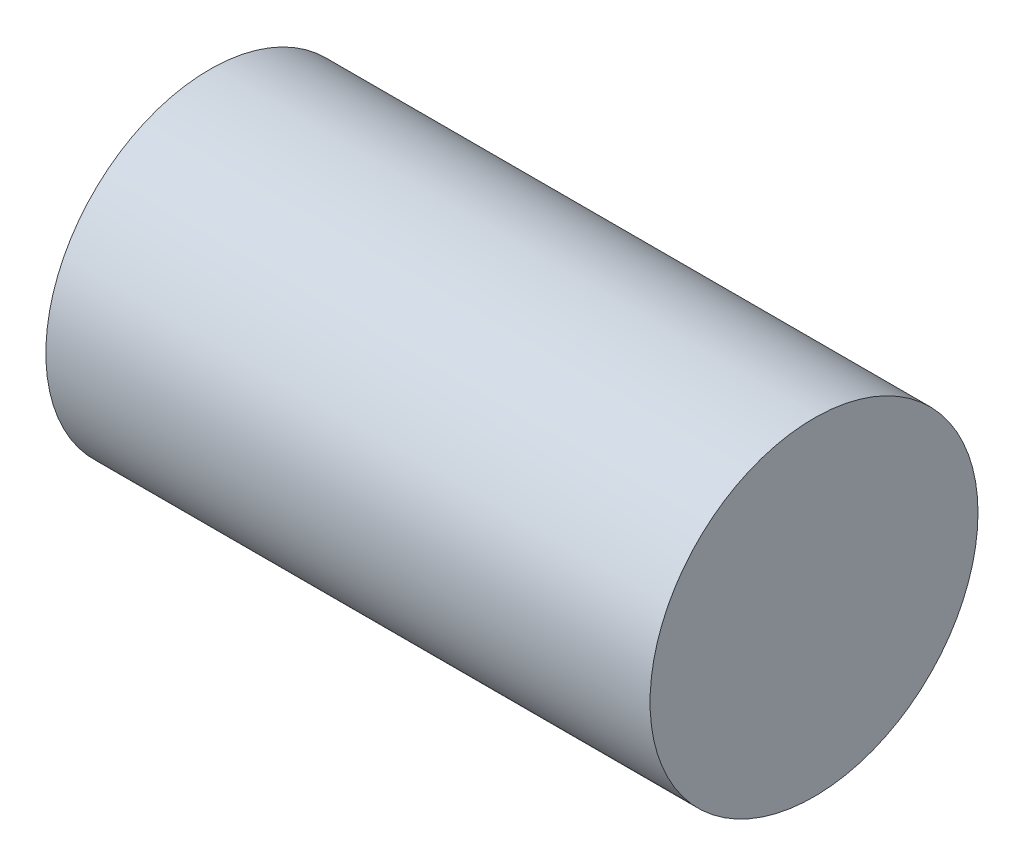
ISO-10303-21;
HEADER;
FILE_DESCRIPTION(('STEP AP214'),'2;1');
FILE_NAME('part.step','',(''),(''),'','','');
FILE_SCHEMA(('AUTOMOTIVE_DESIGN { 1 0 10303 214 1 1 1 1 }'));
ENDSEC;
DATA;
#1=APPLICATION_CONTEXT('core data for automotive mechanical design processes');
#2=APPLICATION_PROTOCOL_DEFINITION('international standard','automotive_design',2000,#1);
#3=PRODUCT_CONTEXT('',#1,'mechanical');
#4=PRODUCT('Part','Part','',(#3));
#5=PRODUCT_RELATED_PRODUCT_CATEGORY('part','',(#4));
#6=PRODUCT_DEFINITION_FORMATION('','',#4);
#7=PRODUCT_DEFINITION_CONTEXT('part definition',#1,'design');
#8=PRODUCT_DEFINITION('design','',#6,#7);
#9=PRODUCT_DEFINITION_SHAPE('','',#8);
#10=(LENGTH_UNIT() NAMED_UNIT(*) SI_UNIT(.MILLI.,.METRE.));
#11=(NAMED_UNIT(*) PLANE_ANGLE_UNIT() SI_UNIT($,.RADIAN.));
#12=(NAMED_UNIT(*) SI_UNIT($,.STERADIAN.) SOLID_ANGLE_UNIT());
#13=UNCERTAINTY_MEASURE_WITH_UNIT(LENGTH_MEASURE(1.E-05),#10,'distance_accuracy_value','');
#14=(GEOMETRIC_REPRESENTATION_CONTEXT(3) GLOBAL_UNCERTAINTY_ASSIGNED_CONTEXT((#13)) GLOBAL_UNIT_ASSIGNED_CONTEXT((#10,
#11,#12)) REPRESENTATION_CONTEXT('',''));
#15=CARTESIAN_POINT('',(0.,0.,0.));
#16=DIRECTION('',(0.,0.,1.));
#17=DIRECTION('',(1.,0.,0.));
#18=AXIS2_PLACEMENT_3D('',#15,#16,#17);
#19=CARTESIAN_POINT('',(18.35,0.,0.));
#20=DIRECTION('',(-1.,0.,0.));
#21=DIRECTION('',(0.,0.,1.));
#22=AXIS2_PLACEMENT_3D('',#19,#20,#21);
#23=CYLINDRICAL_SURFACE('',#22,4.98);
#24=CARTESIAN_POINT('',(18.35,0.,0.));
#25=DIRECTION('',(1.,0.,0.));
#26=DIRECTION('',(0.,0.,-1.));
#27=AXIS2_PLACEMENT_3D('',#24,#25,#26);
#28=CIRCLE('',#27,4.98);
#29=CARTESIAN_POINT('',(18.35,0.,-4.98));
#30=VERTEX_POINT('',#29);
#31=EDGE_CURVE('E10',#30,#30,#28,.T.);
#32=ORIENTED_EDGE('',*,*,#31,.F.);
#33=EDGE_LOOP('',(#32));
#34=FACE_BOUND('',#33,.T.);
#35=CARTESIAN_POINT('',(0.,0.,0.));
#36=DIRECTION('',(1.,0.,0.));
#37=DIRECTION('',(0.,0.,-1.));
#38=AXIS2_PLACEMENT_3D('',#35,#36,#37);
#39=CIRCLE('',#38,4.98);
#40=CARTESIAN_POINT('',(0.,0.,-4.98));
#41=VERTEX_POINT('',#40);
#42=EDGE_CURVE('E48',#41,#41,#39,.T.);
#43=ORIENTED_EDGE('',*,*,#42,.T.);
#44=EDGE_LOOP('',(#43));
#45=FACE_BOUND('',#44,.T.);
#46=ADVANCED_FACE('F45',(#34,#45),#23,.T.);
#47=CARTESIAN_POINT('',(18.35,0.,0.));
#48=DIRECTION('',(1.,0.,0.));
#49=DIRECTION('',(0.,0.,-1.));
#50=AXIS2_PLACEMENT_3D('',#47,#48,#49);
#51=PLANE('',#50);
#52=ORIENTED_EDGE('',*,*,#31,.T.);
#53=EDGE_LOOP('',(#52));
#54=FACE_BOUND('',#53,.T.);
#55=ADVANCED_FACE('F62',(#54),#51,.T.);
#56=CARTESIAN_POINT('',(0.,0.,0.));
#57=DIRECTION('',(1.,0.,0.));
#58=DIRECTION('',(0.,0.,-1.));
#59=AXIS2_PLACEMENT_3D('',#56,#57,#58);
#60=PLANE('',#59);
#61=ORIENTED_EDGE('',*,*,#42,.F.);
#62=EDGE_LOOP('',(#61));
#63=FACE_BOUND('',#62,.T.);
#64=ADVANCED_FACE('F60',(#63),#60,.F.);
#65=CLOSED_SHELL('',(#46,#55,#64));
#66=MANIFOLD_SOLID_BREP('B2',#65);
#67=ADVANCED_BREP_SHAPE_REPRESENTATION('',(#18,#66),#14);
#68=SHAPE_DEFINITION_REPRESENTATION(#9,#67);
ENDSEC;
END-ISO-10303-21;
